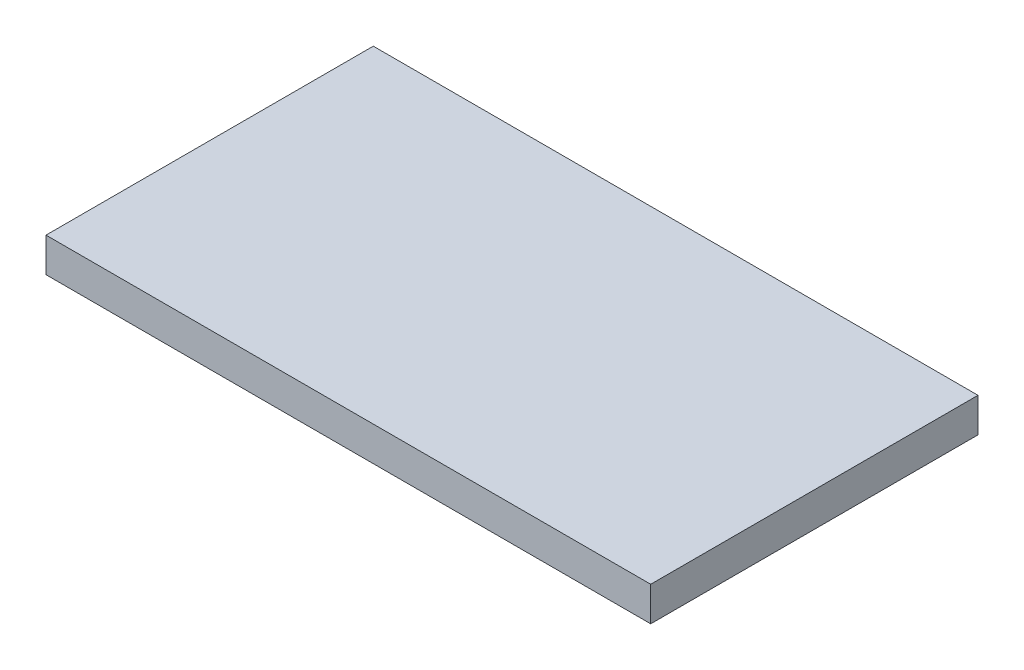
ISO-10303-21;
HEADER;
FILE_DESCRIPTION(('STEP AP214'),'2;1');
FILE_NAME('part.step','',(''),(''),'','','');
FILE_SCHEMA(('AUTOMOTIVE_DESIGN { 1 0 10303 214 1 1 1 1 }'));
ENDSEC;
DATA;
#1=APPLICATION_CONTEXT('core data for automotive mechanical design processes');
#2=APPLICATION_PROTOCOL_DEFINITION('international standard','automotive_design',2000,#1);
#3=PRODUCT_CONTEXT('',#1,'mechanical');
#4=PRODUCT('Part','Part','',(#3));
#5=PRODUCT_RELATED_PRODUCT_CATEGORY('part','',(#4));
#6=PRODUCT_DEFINITION_FORMATION('','',#4);
#7=PRODUCT_DEFINITION_CONTEXT('part definition',#1,'design');
#8=PRODUCT_DEFINITION('design','',#6,#7);
#9=PRODUCT_DEFINITION_SHAPE('','',#8);
#10=(LENGTH_UNIT() NAMED_UNIT(*) SI_UNIT(.MILLI.,.METRE.));
#11=(NAMED_UNIT(*) PLANE_ANGLE_UNIT() SI_UNIT($,.RADIAN.));
#12=(NAMED_UNIT(*) SI_UNIT($,.STERADIAN.) SOLID_ANGLE_UNIT());
#13=UNCERTAINTY_MEASURE_WITH_UNIT(LENGTH_MEASURE(1.E-05),#10,'distance_accuracy_value','');
#14=(GEOMETRIC_REPRESENTATION_CONTEXT(3) GLOBAL_UNCERTAINTY_ASSIGNED_CONTEXT((#13)) GLOBAL_UNIT_ASSIGNED_CONTEXT((#10,
#11,#12)) REPRESENTATION_CONTEXT('',''));
#15=CARTESIAN_POINT('',(0.,0.,0.));
#16=DIRECTION('',(0.,0.,1.));
#17=DIRECTION('',(1.,0.,0.));
#18=AXIS2_PLACEMENT_3D('',#15,#16,#17);
#19=CARTESIAN_POINT('',(123.19,13.97,66.675));
#20=DIRECTION('',(-1.,0.,0.));
#21=DIRECTION('',(0.,0.,1.));
#22=AXIS2_PLACEMENT_3D('',#19,#20,#21);
#23=PLANE('',#22);
#24=DIRECTION('',(0.,0.,-1.));
#25=VECTOR('',#24,1.);
#26=CARTESIAN_POINT('',(123.19,0.,66.675));
#27=LINE('',#26,#25);
#28=CARTESIAN_POINT('',(123.19,0.,66.675));
#29=VERTEX_POINT('',#28);
#30=CARTESIAN_POINT('',(123.19,0.,-66.675));
#31=VERTEX_POINT('',#30);
#32=EDGE_CURVE('E109',#29,#31,#27,.T.);
#33=ORIENTED_EDGE('',*,*,#32,.T.);
#34=DIRECTION('',(0.,-1.,0.));
#35=VECTOR('',#34,1.);
#36=CARTESIAN_POINT('',(123.19,13.97,-66.675));
#37=LINE('',#36,#35);
#38=CARTESIAN_POINT('',(123.19,13.97,-66.675));
#39=VERTEX_POINT('',#38);
#40=EDGE_CURVE('E11',#39,#31,#37,.T.);
#41=ORIENTED_EDGE('',*,*,#40,.F.);
#42=DIRECTION('',(0.,0.,-1.));
#43=VECTOR('',#42,1.);
#44=CARTESIAN_POINT('',(123.19,13.97,66.675));
#45=LINE('',#44,#43);
#46=CARTESIAN_POINT('',(123.19,13.97,66.675));
#47=VERTEX_POINT('',#46);
#48=EDGE_CURVE('E93',#47,#39,#45,.T.);
#49=ORIENTED_EDGE('',*,*,#48,.F.);
#50=DIRECTION('',(0.,-1.,0.));
#51=VECTOR('',#50,1.);
#52=CARTESIAN_POINT('',(123.19,13.97,66.675));
#53=LINE('',#52,#51);
#54=EDGE_CURVE('E105',#47,#29,#53,.T.);
#55=ORIENTED_EDGE('',*,*,#54,.T.);
#56=EDGE_LOOP('',(#33,#41,#49,#55));
#57=FACE_BOUND('',#56,.T.);
#58=ADVANCED_FACE('F41',(#57),#23,.F.);
#59=CARTESIAN_POINT('',(-123.19,13.97,-66.675));
#60=DIRECTION('',(0.,0.,1.));
#61=DIRECTION('',(1.,0.,0.));
#62=AXIS2_PLACEMENT_3D('',#59,#60,#61);
#63=PLANE('',#62);
#64=DIRECTION('',(-1.,0.,0.));
#65=VECTOR('',#64,1.);
#66=CARTESIAN_POINT('',(-123.19,0.,-66.675));
#67=LINE('',#66,#65);
#68=CARTESIAN_POINT('',(-123.19,0.,-66.675));
#69=VERTEX_POINT('',#68);
#70=EDGE_CURVE('E98',#31,#69,#67,.T.);
#71=ORIENTED_EDGE('',*,*,#70,.T.);
#72=DIRECTION('',(0.,-1.,0.));
#73=VECTOR('',#72,1.);
#74=CARTESIAN_POINT('',(-123.19,13.97,-66.675));
#75=LINE('',#74,#73);
#76=CARTESIAN_POINT('',(-123.19,13.97,-66.675));
#77=VERTEX_POINT('',#76);
#78=EDGE_CURVE('E50',#77,#69,#75,.T.);
#79=ORIENTED_EDGE('',*,*,#78,.F.);
#80=DIRECTION('',(-1.,0.,0.));
#81=VECTOR('',#80,1.);
#82=CARTESIAN_POINT('',(-123.19,13.97,-66.675));
#83=LINE('',#82,#81);
#84=EDGE_CURVE('E88',#39,#77,#83,.T.);
#85=ORIENTED_EDGE('',*,*,#84,.F.);
#86=ORIENTED_EDGE('',*,*,#40,.T.);
#87=EDGE_LOOP('',(#71,#79,#85,#86));
#88=FACE_BOUND('',#87,.T.);
#89=ADVANCED_FACE('F97',(#88),#63,.F.);
#90=CARTESIAN_POINT('',(-123.19,13.97,66.675));
#91=DIRECTION('',(1.,0.,0.));
#92=DIRECTION('',(0.,0.,-1.));
#93=AXIS2_PLACEMENT_3D('',#90,#91,#92);
#94=PLANE('',#93);
#95=DIRECTION('',(0.,0.,1.));
#96=VECTOR('',#95,1.);
#97=CARTESIAN_POINT('',(-123.19,0.,66.675));
#98=LINE('',#97,#96);
#99=CARTESIAN_POINT('',(-123.19,0.,66.675));
#100=VERTEX_POINT('',#99);
#101=EDGE_CURVE('E75',#69,#100,#98,.T.);
#102=ORIENTED_EDGE('',*,*,#101,.T.);
#103=DIRECTION('',(0.,-1.,0.));
#104=VECTOR('',#103,1.);
#105=CARTESIAN_POINT('',(-123.19,13.97,66.675));
#106=LINE('',#105,#104);
#107=CARTESIAN_POINT('',(-123.19,13.97,66.675));
#108=VERTEX_POINT('',#107);
#109=EDGE_CURVE('E100',#108,#100,#106,.T.);
#110=ORIENTED_EDGE('',*,*,#109,.F.);
#111=DIRECTION('',(0.,0.,1.));
#112=VECTOR('',#111,1.);
#113=CARTESIAN_POINT('',(-123.19,13.97,66.675));
#114=LINE('',#113,#112);
#115=EDGE_CURVE('E91',#77,#108,#114,.T.);
#116=ORIENTED_EDGE('',*,*,#115,.F.);
#117=ORIENTED_EDGE('',*,*,#78,.T.);
#118=EDGE_LOOP('',(#102,#110,#116,#117));
#119=FACE_BOUND('',#118,.T.);
#120=ADVANCED_FACE('F101',(#119),#94,.F.);
#121=CARTESIAN_POINT('',(-123.19,13.97,66.675));
#122=DIRECTION('',(0.,0.,-1.));
#123=DIRECTION('',(-1.,0.,0.));
#124=AXIS2_PLACEMENT_3D('',#121,#122,#123);
#125=PLANE('',#124);
#126=DIRECTION('',(1.,0.,0.));
#127=VECTOR('',#126,1.);
#128=CARTESIAN_POINT('',(-123.19,0.,66.675));
#129=LINE('',#128,#127);
#130=EDGE_CURVE('E81',#100,#29,#129,.T.);
#131=ORIENTED_EDGE('',*,*,#130,.T.);
#132=ORIENTED_EDGE('',*,*,#54,.F.);
#133=DIRECTION('',(1.,0.,0.));
#134=VECTOR('',#133,1.);
#135=CARTESIAN_POINT('',(-123.19,13.97,66.675));
#136=LINE('',#135,#134);
#137=EDGE_CURVE('E58',#108,#47,#136,.T.);
#138=ORIENTED_EDGE('',*,*,#137,.F.);
#139=ORIENTED_EDGE('',*,*,#109,.T.);
#140=EDGE_LOOP('',(#131,#132,#138,#139));
#141=FACE_BOUND('',#140,.T.);
#142=ADVANCED_FACE('F122',(#141),#125,.F.);
#143=CARTESIAN_POINT('',(0.,13.97,0.));
#144=DIRECTION('',(0.,-1.,0.));
#145=DIRECTION('',(0.,0.,-1.));
#146=AXIS2_PLACEMENT_3D('',#143,#144,#145);
#147=PLANE('',#146);
#148=ORIENTED_EDGE('',*,*,#48,.T.);
#149=ORIENTED_EDGE('',*,*,#84,.T.);
#150=ORIENTED_EDGE('',*,*,#115,.T.);
#151=ORIENTED_EDGE('',*,*,#137,.T.);
#152=EDGE_LOOP('',(#148,#149,#150,#151));
#153=FACE_BOUND('',#152,.T.);
#154=ADVANCED_FACE('F89',(#153),#147,.F.);
#155=CARTESIAN_POINT('',(0.,0.,0.));
#156=DIRECTION('',(0.,-1.,0.));
#157=DIRECTION('',(0.,0.,-1.));
#158=AXIS2_PLACEMENT_3D('',#155,#156,#157);
#159=PLANE('',#158);
#160=ORIENTED_EDGE('',*,*,#32,.F.);
#161=ORIENTED_EDGE('',*,*,#130,.F.);
#162=ORIENTED_EDGE('',*,*,#101,.F.);
#163=ORIENTED_EDGE('',*,*,#70,.F.);
#164=EDGE_LOOP('',(#160,#161,#162,#163));
#165=FACE_BOUND('',#164,.T.);
#166=ADVANCED_FACE('F125',(#165),#159,.T.);
#167=CLOSED_SHELL('',(#58,#89,#120,#142,#154,#166));
#168=MANIFOLD_SOLID_BREP('B2',#167);
#169=ADVANCED_BREP_SHAPE_REPRESENTATION('',(#18,#168),#14);
#170=SHAPE_DEFINITION_REPRESENTATION(#9,#169);
ENDSEC;
END-ISO-10303-21;
